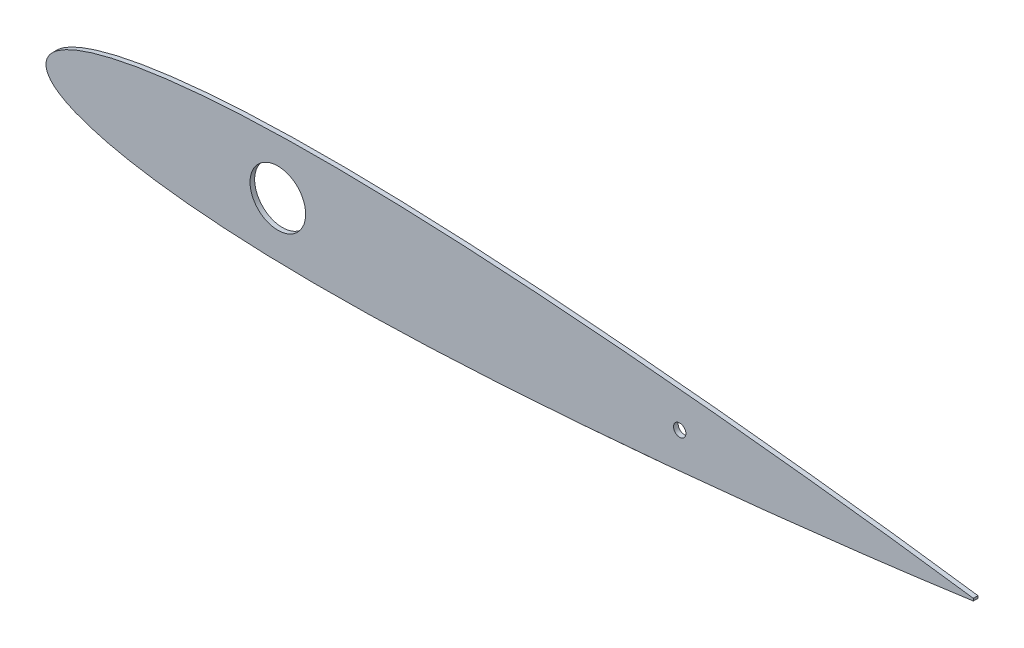
ISO-10303-21;
HEADER;
FILE_DESCRIPTION(('STEP AP214'),'2;1');
FILE_NAME('part.step','',(''),(''),'','','');
FILE_SCHEMA(('AUTOMOTIVE_DESIGN { 1 0 10303 214 1 1 1 1 }'));
ENDSEC;
DATA;
#1=APPLICATION_CONTEXT('core data for automotive mechanical design processes');
#2=APPLICATION_PROTOCOL_DEFINITION('international standard','automotive_design',2000,#1);
#3=PRODUCT_CONTEXT('',#1,'mechanical');
#4=PRODUCT('Part','Part','',(#3));
#5=PRODUCT_RELATED_PRODUCT_CATEGORY('part','',(#4));
#6=PRODUCT_DEFINITION_FORMATION('','',#4);
#7=PRODUCT_DEFINITION_CONTEXT('part definition',#1,'design');
#8=PRODUCT_DEFINITION('design','',#6,#7);
#9=PRODUCT_DEFINITION_SHAPE('','',#8);
#10=(LENGTH_UNIT() NAMED_UNIT(*) SI_UNIT(.MILLI.,.METRE.));
#11=(NAMED_UNIT(*) PLANE_ANGLE_UNIT() SI_UNIT($,.RADIAN.));
#12=(NAMED_UNIT(*) SI_UNIT($,.STERADIAN.) SOLID_ANGLE_UNIT());
#13=UNCERTAINTY_MEASURE_WITH_UNIT(LENGTH_MEASURE(1.E-05),#10,'distance_accuracy_value','');
#14=(GEOMETRIC_REPRESENTATION_CONTEXT(3) GLOBAL_UNCERTAINTY_ASSIGNED_CONTEXT((#13)) GLOBAL_UNIT_ASSIGNED_CONTEXT((#10,
#11,#12)) REPRESENTATION_CONTEXT('',''));
#15=CARTESIAN_POINT('',(0.,0.,0.));
#16=DIRECTION('',(0.,0.,1.));
#17=DIRECTION('',(1.,0.,0.));
#18=AXIS2_PLACEMENT_3D('',#15,#16,#17);
#19=CARTESIAN_POINT('',(300.,0.378,1.5));
#20=CARTESIAN_POINT('',(299.270406423723,0.479445821702321,1.5));
#21=CARTESIAN_POINT('',(297.234667094079,0.762503753929655,1.5));
#22=CARTESIAN_POINT('',(293.659650160598,1.25767350567564,1.5));
#23=CARTESIAN_POINT('',(289.112411794917,1.87424244263317,1.5));
#24=CARTESIAN_POINT('',(284.080816659039,2.54451744035542,1.5));
#25=CARTESIAN_POINT('',(278.752044218457,3.23812231587756,1.5));
#26=CARTESIAN_POINT('',(273.265899022492,3.93494643569603,1.5));
#27=CARTESIAN_POINT('',(267.705955472008,4.62901994283452,1.5));
#28=CARTESIAN_POINT('',(262.114563019878,5.31306910693868,1.5));
#29=CARTESIAN_POINT('',(256.508348909458,5.98219181245687,1.5));
#30=CARTESIAN_POINT('',(250.891738994323,6.63799080906206,1.5));
#31=CARTESIAN_POINT('',(245.269556965141,7.28177923500822,1.5));
#32=CARTESIAN_POINT('',(239.647345348642,7.91223276352409,1.5));
#33=CARTESIAN_POINT('',(234.025130106878,8.52699204615673,1.5));
#34=CARTESIAN_POINT('',(228.399087902931,9.12622976388424,1.5));
#35=CARTESIAN_POINT('',(222.76825764507,9.71307760610579,1.5));
#36=CARTESIAN_POINT('',(217.135920793231,10.2874598097057,1.5));
#37=CARTESIAN_POINT('',(211.505410154051,10.8469410839575,1.5));
#38=CARTESIAN_POINT('',(205.877619803237,11.3916428267252,1.5));
#39=CARTESIAN_POINT('',(200.251512373849,11.9208846239163,1.5));
#40=CARTESIAN_POINT('',(194.626420536409,12.4346170780367,1.5));
#41=CARTESIAN_POINT('',(189.002797137157,12.9319118094686,1.5));
#42=CARTESIAN_POINT('',(183.381530937822,13.4130975813696,1.5));
#43=CARTESIAN_POINT('',(177.763225616091,13.8763767009773,1.5));
#44=CARTESIAN_POINT('',(172.148301533052,14.3212371935345,1.5));
#45=CARTESIAN_POINT('',(166.537529461529,14.7478209184035,1.5));
#46=CARTESIAN_POINT('',(160.931736194082,15.1542281440202,1.5));
#47=CARTESIAN_POINT('',(155.331708850266,15.5391008558727,1.5));
#48=CARTESIAN_POINT('',(149.737538344952,15.9026495636587,1.5));
#49=CARTESIAN_POINT('',(144.148688279318,16.241846118568,1.5));
#50=CARTESIAN_POINT('',(138.565679604284,16.5574205464223,1.5));
#51=CARTESIAN_POINT('',(132.990859803018,16.8473975552547,1.5));
#52=CARTESIAN_POINT('',(127.427439440236,17.1102116785312,1.5));
#53=CARTESIAN_POINT('',(121.877619637439,17.3438917175145,1.5));
#54=CARTESIAN_POINT('',(116.340758577333,17.5452568128182,1.5));
#55=CARTESIAN_POINT('',(110.815476382379,17.712679119923,1.5));
#56=CARTESIAN_POINT('',(105.301273398415,17.8444979379819,1.5));
#57=CARTESIAN_POINT('',(99.8005701155126,17.9400918128776,1.5));
#58=CARTESIAN_POINT('',(94.3174358437247,17.9965904385618,1.5));
#59=CARTESIAN_POINT('',(88.8557640671298,18.0101244579531,1.5));
#60=CARTESIAN_POINT('',(83.4186479748791,17.9792338403315,1.5));
#61=CARTESIAN_POINT('',(78.0084808270908,17.8991607130085,1.5));
#62=CARTESIAN_POINT('',(72.6284553647751,17.7670337872511,1.5));
#63=CARTESIAN_POINT('',(67.2827387457577,17.5794139337101,1.5));
#64=CARTESIAN_POINT('',(61.9773648945375,17.331515488689,1.5));
#65=CARTESIAN_POINT('',(56.7206910156783,17.0210326511062,1.5));
#66=CARTESIAN_POINT('',(51.5251753215055,16.6409580698619,1.5));
#67=CARTESIAN_POINT('',(46.4082026187076,16.1901885907441,1.5));
#68=CARTESIAN_POINT('',(41.3941760651905,15.6616690993154,1.5));
#69=CARTESIAN_POINT('',(36.5156710865437,15.0539637839737,1.5));
#70=CARTESIAN_POINT('',(31.8190094409283,14.3656236049764,1.5));
#71=CARTESIAN_POINT('',(27.3661648285309,13.6034756838757,1.5));
#72=CARTESIAN_POINT('',(23.2352179540624,12.7825834438859,1.5));
#73=CARTESIAN_POINT('',(19.5026424507863,11.9202507512816,1.5));
#74=CARTESIAN_POINT('',(16.2182713927649,11.0445977962822,1.5));
#75=CARTESIAN_POINT('',(13.3891860155784,10.1750762553965,1.5));
#76=CARTESIAN_POINT('',(10.9849293334544,9.33349871540906,1.5));
#77=CARTESIAN_POINT('',(8.96156147750924,8.52206288153796,1.5));
#78=CARTESIAN_POINT('',(7.26729205281864,7.74697600174495,1.5));
#79=CARTESIAN_POINT('',(5.84605246563954,7.01062562176008,1.5));
#80=CARTESIAN_POINT('',(4.64771108498271,6.30063403293287,1.5));
#81=CARTESIAN_POINT('',(3.62823525123192,5.60651366797511,1.5));
#82=CARTESIAN_POINT('',(2.75190919699738,4.92663525162572,1.5));
#83=CARTESIAN_POINT('',(2.0062573601689,4.24991725904032,1.5));
#84=CARTESIAN_POINT('',(1.39058613668709,3.570259491991,1.5));
#85=CARTESIAN_POINT('',(0.901000434809516,2.89094225228363,1.5));
#86=CARTESIAN_POINT('',(0.529275534924718,2.22021927340558,1.5));
#87=CARTESIAN_POINT('',(0.260479536936117,1.56645893590234,1.5));
#88=CARTESIAN_POINT('',(0.0857126538537306,0.931035928118987,1.5));
#89=CARTESIAN_POINT('',(-0.00350924718492415,0.308981014512189,1.5));
#90=CARTESIAN_POINT('',(-0.00350924718492199,-0.308981014512209,1.5));
#91=CARTESIAN_POINT('',(0.0857126538537279,-0.931035928118965,1.5));
#92=CARTESIAN_POINT('',(0.260479536936107,-1.56645893590232,1.5));
#93=CARTESIAN_POINT('',(0.529275534924743,-2.2202192734056,1.5));
#94=CARTESIAN_POINT('',(0.901000434809474,-2.89094225228368,1.5));
#95=CARTESIAN_POINT('',(1.39058613668717,-3.57025949199063,1.5));
#96=CARTESIAN_POINT('',(2.00625736016862,-4.24991725904197,1.5));
#97=CARTESIAN_POINT('',(2.75190919699857,-4.92663525161857,1.5));
#98=CARTESIAN_POINT('',(3.62823525122678,-5.60651366800603,1.5));
#99=CARTESIAN_POINT('',(4.6477110850053,-6.3006340327972,1.5));
#100=CARTESIAN_POINT('',(5.84605246553727,-7.01062562237321,1.5));
#101=CARTESIAN_POINT('',(7.26729205329404,-7.74697599889616,1.5));
#102=CARTESIAN_POINT('',(8.96156147525896,-8.5220628950217,1.5));
#103=CARTESIAN_POINT('',(10.9849293441544,-9.33349865129378,1.5));
#104=CARTESIAN_POINT('',(13.3891859649807,-10.1750765585832,1.5));
#105=CARTESIAN_POINT('',(16.218271629693,-11.0445963765829,1.5));
#106=CARTESIAN_POINT('',(19.5026413612413,-11.9202572799561,1.5));
#107=CARTESIAN_POINT('',(23.2352227989104,-12.78255441302,1.5));
#108=CARTESIAN_POINT('',(27.3661275586072,-13.6035961608478,1.5));
#109=CARTESIAN_POINT('',(31.8190750083372,-14.3651133634918,1.5));
#110=CARTESIAN_POINT('',(36.5156346373272,-15.0541060972868,1.5));
#111=CARTESIAN_POINT('',(41.3941822041013,-15.6616288870965,1.5));
#112=CARTESIAN_POINT('',(46.4082009236496,-16.1901996940233,1.5));
#113=CARTESIAN_POINT('',(51.5251757859908,-16.6409550273053,1.5));
#114=CARTESIAN_POINT('',(56.7206908890808,-17.0210334803687,1.5));
#115=CARTESIAN_POINT('',(61.9773649289189,-17.3315152634777,1.5));
#116=CARTESIAN_POINT('',(67.2827387364428,-17.5794139947263,1.5));
#117=CARTESIAN_POINT('',(72.6284553672946,-17.767033770747,1.5));
#118=CARTESIAN_POINT('',(78.0084808264101,-17.8991607174675,1.5));
#119=CARTESIAN_POINT('',(83.4186479750628,-17.9792338391277,1.5));
#120=CARTESIAN_POINT('',(88.8557640670803,-18.0101244582778,1.5));
#121=CARTESIAN_POINT('',(94.317435843738,-17.9965904384742,1.5));
#122=CARTESIAN_POINT('',(99.8005701155091,-17.9400918129012,1.5));
#123=CARTESIAN_POINT('',(105.301273398416,-17.8444979379756,1.5));
#124=CARTESIAN_POINT('',(110.815476382379,-17.7126791199247,1.5));
#125=CARTESIAN_POINT('',(116.340758577333,-17.5452568128177,1.5));
#126=CARTESIAN_POINT('',(121.877619637439,-17.3438917175146,1.5));
#127=CARTESIAN_POINT('',(127.427439440236,-17.1102116785312,1.5));
#128=CARTESIAN_POINT('',(132.990859803018,-16.8473975552547,1.5));
#129=CARTESIAN_POINT('',(138.565679604284,-16.5574205464223,1.5));
#130=CARTESIAN_POINT('',(144.148688279318,-16.241846118568,1.5));
#131=CARTESIAN_POINT('',(149.737538344952,-15.9026495636587,1.5));
#132=CARTESIAN_POINT('',(155.331708850266,-15.5391008558727,1.5));
#133=CARTESIAN_POINT('',(160.931736194082,-15.1542281440202,1.5));
#134=CARTESIAN_POINT('',(166.537529461529,-14.7478209184035,1.5));
#135=CARTESIAN_POINT('',(172.148301533052,-14.3212371935345,1.5));
#136=CARTESIAN_POINT('',(177.763225616091,-13.8763767009773,1.5));
#137=CARTESIAN_POINT('',(183.381530937822,-13.4130975813696,1.5));
#138=CARTESIAN_POINT('',(189.002797137156,-12.9319118094686,1.5));
#139=CARTESIAN_POINT('',(194.626420536409,-12.4346170780367,1.5));
#140=CARTESIAN_POINT('',(200.251512373849,-11.9208846239163,1.5));
#141=CARTESIAN_POINT('',(205.877619803237,-11.3916428267251,1.5));
#142=CARTESIAN_POINT('',(211.505410154051,-10.8469410839575,1.5));
#143=CARTESIAN_POINT('',(217.135920793231,-10.2874598097057,1.5));
#144=CARTESIAN_POINT('',(222.76825764507,-9.71307760610578,1.5));
#145=CARTESIAN_POINT('',(228.399087902931,-9.12622976388424,1.5));
#146=CARTESIAN_POINT('',(234.025130106878,-8.52699204615673,1.5));
#147=CARTESIAN_POINT('',(239.647345348642,-7.91223276352409,1.5));
#148=CARTESIAN_POINT('',(245.269556965141,-7.28177923500822,1.5));
#149=CARTESIAN_POINT('',(250.891738994323,-6.63799080906206,1.5));
#150=CARTESIAN_POINT('',(256.508348909458,-5.98219181245686,1.5));
#151=CARTESIAN_POINT('',(262.114563019878,-5.31306910693868,1.5));
#152=CARTESIAN_POINT('',(267.705955472008,-4.62901994283452,1.5));
#153=CARTESIAN_POINT('',(273.265899022492,-3.93494643569603,1.5));
#154=CARTESIAN_POINT('',(278.752044218457,-3.23812231587756,1.5));
#155=CARTESIAN_POINT('',(284.080816659039,-2.54451744035542,1.5));
#156=CARTESIAN_POINT('',(289.112411794917,-1.87424244263317,1.5));
#157=CARTESIAN_POINT('',(293.659650160598,-1.25767350567564,1.5));
#158=CARTESIAN_POINT('',(297.234667094079,-0.76250375392966,1.5));
#159=CARTESIAN_POINT('',(299.270406423723,-0.479445821702321,1.5));
#160=CARTESIAN_POINT('',(300.,-0.378,1.5));
#161=B_SPLINE_CURVE_WITH_KNOTS('',3,(#19,#20,#21,#22,#23,#24,#25,#26,#27,#28,#29,#30,#31,#32,
#33,#34,#35,#36,#37,#38,#39,#40,#41,#42,#43,#44,#45,#46,#47,#48,#49,#50,#51,#52,#53,#54,#55,#56,
#57,#58,#59,#60,#61,#62,#63,#64,#65,#66,#67,#68,#69,#70,#71,#72,#73,#74,#75,#76,#77,#78,#79,#80,
#81,#82,#83,#84,#85,#86,#87,#88,#89,#90,#91,#92,#93,#94,#95,#96,#97,#98,#99,#100,#101,#102,#103,
#104,#105,#106,#107,#108,#109,#110,#111,#112,#113,#114,#115,#116,#117,#118,#119,#120,#121,#122,
#123,#124,#125,#126,#127,#128,#129,#130,#131,#132,#133,#134,#135,#136,#137,#138,#139,#140,#141,
#142,#143,#144,#145,#146,#147,#148,#149,#150,#151,#152,#153,#154,#155,#156,#157,#158,#159,#160),
.UNSPECIFIED.,.F.,.F.,(4,1,1,1,1,1,1,1,1,1,1,1,1,1,1,1,1,1,1,1,1,1,1,1,1,1,1,1,1,1,1,1,1,1,1,1,
1,1,1,1,1,1,1,1,1,1,1,1,1,1,1,1,1,1,1,1,1,1,1,1,1,1,1,1,1,1,1,1,1,1,1,1,1,1,1,1,1,1,1,1,1,1,1,1,
1,1,1,1,1,1,1,1,1,1,1,1,1,1,1,1,1,1,1,1,1,1,1,1,1,1,1,1,1,1,1,1,1,1,1,1,1,1,1,1,1,1,1,1,1,1,1,1,
1,1,1,1,1,1,1,4),(0.,0.00361222059404388,0.0100789532278554,0.0176986181570895,
0.0261151107220122,0.0349709660638799,0.0440503796486832,0.0532343297369713,0.0624475697827881,
0.0716739929600303,0.0809213185094618,0.0901775382979332,0.0994243421366575,0.108664440992277,
0.117912199004999,0.127169502180609,0.136426594565023,0.145675425736823,0.154916495397513,
0.164153236916375,0.173386648526191,0.182615736180586,0.191838089492061,0.201053134496137,
0.210260392550908,0.219458942389608,0.228646746886173,0.237822316287067,0.24698522413025,
0.25613738364592,0.265279415916296,0.274406949966901,0.283512193452554,0.292591781113348,
0.30164628535433,0.310681792653752,0.31969906757785,0.32869451957993,0.337660159695399,
0.346588583205171,0.355477411634764,0.364322937295264,0.373121613643215,0.381867635356829,
0.390553004884712,0.399166025869356,0.407689628257838,0.416098119030288,0.424354887451602,
0.432412428746428,0.440204728485537,0.447630505181733,0.454563637698397,0.460855379429517,
0.466413319364109,0.471228610451128,0.475365774282038,0.478901259753558,0.481915077255184,
0.484498871900912,0.486747127386087,0.488741251833575,0.490543179252672,0.492182103901344,
0.493672830547239,0.495031907807012,0.496279059618418,0.497424736506128,0.498490165528455,
0.499502757789975,0.500497253863142,0.501509846124661,0.502575275146988,0.503720952034698,
0.504968103846104,0.506327181105877,0.507817907751772,0.509456832400444,0.511258759819541,
0.51325288426703,0.515501139752205,0.518084934397933,0.521098751899559,0.524634237371078,
0.528771401201989,0.533586692289008,0.539144632223599,0.545436373954719,0.552369506471383,
0.559795200118754,0.567587571253572,0.575645112548398,0.583901880969712,0.592310371742162,
0.600833974130644,0.609446995115288,0.618132364643171,0.626878386356785,0.635677062704736,
0.644522588365236,0.653411416794829,0.662339840304601,0.67130548042007,0.68030093242215,
0.689318207346248,0.69835371464567,0.707408218886652,0.716487806547446,0.725593050033099,
0.734720584083704,0.74386261635408,0.75301477586975,0.762177683712933,0.771353253113827,
0.780541057610392,0.789739607449093,0.798946865503863,0.808161910507939,0.817384263819414,
0.826613351473809,0.835846763083625,0.845083504602487,0.854324574263177,0.863573405434977,
0.872830497819391,0.882087800995001,0.891335559007723,0.900575657863343,0.909822461702067,
0.919078681490538,0.92832600703997,0.937552430217212,0.946765670263029,0.955949620351317,
0.96502903393612,0.973884889277988,0.982301381842911,0.989921046772145,0.996387779405956,1.),.UNSPECIFIED.);
#162=DIRECTION('',(0.,0.,-1.));
#163=VECTOR('',#162,1.);
#164=SURFACE_OF_LINEAR_EXTRUSION('',#161,#163);
#165=CARTESIAN_POINT('',(300.,0.378,0.));
#166=CARTESIAN_POINT('',(299.270406423723,0.479445821702321,0.));
#167=CARTESIAN_POINT('',(297.234667094079,0.762503753929655,0.));
#168=CARTESIAN_POINT('',(293.659650160598,1.25767350567564,0.));
#169=CARTESIAN_POINT('',(289.112411794917,1.87424244263317,0.));
#170=CARTESIAN_POINT('',(284.080816659039,2.54451744035542,0.));
#171=CARTESIAN_POINT('',(278.752044218457,3.23812231587756,0.));
#172=CARTESIAN_POINT('',(273.265899022492,3.93494643569603,0.));
#173=CARTESIAN_POINT('',(267.705955472008,4.62901994283452,0.));
#174=CARTESIAN_POINT('',(262.114563019878,5.31306910693868,0.));
#175=CARTESIAN_POINT('',(256.508348909458,5.98219181245687,0.));
#176=CARTESIAN_POINT('',(250.891738994323,6.63799080906206,0.));
#177=CARTESIAN_POINT('',(245.269556965141,7.28177923500822,0.));
#178=CARTESIAN_POINT('',(239.647345348642,7.91223276352409,0.));
#179=CARTESIAN_POINT('',(234.025130106878,8.52699204615673,0.));
#180=CARTESIAN_POINT('',(228.399087902931,9.12622976388424,0.));
#181=CARTESIAN_POINT('',(222.76825764507,9.71307760610579,0.));
#182=CARTESIAN_POINT('',(217.135920793231,10.2874598097057,0.));
#183=CARTESIAN_POINT('',(211.505410154051,10.8469410839575,0.));
#184=CARTESIAN_POINT('',(205.877619803237,11.3916428267252,0.));
#185=CARTESIAN_POINT('',(200.251512373849,11.9208846239163,0.));
#186=CARTESIAN_POINT('',(194.626420536409,12.4346170780367,0.));
#187=CARTESIAN_POINT('',(189.002797137157,12.9319118094686,0.));
#188=CARTESIAN_POINT('',(183.381530937822,13.4130975813696,0.));
#189=CARTESIAN_POINT('',(177.763225616091,13.8763767009773,0.));
#190=CARTESIAN_POINT('',(172.148301533052,14.3212371935345,0.));
#191=CARTESIAN_POINT('',(166.537529461529,14.7478209184035,0.));
#192=CARTESIAN_POINT('',(160.931736194082,15.1542281440202,0.));
#193=CARTESIAN_POINT('',(155.331708850266,15.5391008558727,0.));
#194=CARTESIAN_POINT('',(149.737538344952,15.9026495636587,0.));
#195=CARTESIAN_POINT('',(144.148688279318,16.241846118568,0.));
#196=CARTESIAN_POINT('',(138.565679604284,16.5574205464223,0.));
#197=CARTESIAN_POINT('',(132.990859803018,16.8473975552547,0.));
#198=CARTESIAN_POINT('',(127.427439440236,17.1102116785312,0.));
#199=CARTESIAN_POINT('',(121.877619637439,17.3438917175145,0.));
#200=CARTESIAN_POINT('',(116.340758577333,17.5452568128182,0.));
#201=CARTESIAN_POINT('',(110.815476382379,17.712679119923,0.));
#202=CARTESIAN_POINT('',(105.301273398415,17.8444979379819,0.));
#203=CARTESIAN_POINT('',(99.8005701155126,17.9400918128776,0.));
#204=CARTESIAN_POINT('',(94.3174358437247,17.9965904385618,0.));
#205=CARTESIAN_POINT('',(88.8557640671298,18.0101244579531,0.));
#206=CARTESIAN_POINT('',(83.4186479748791,17.9792338403315,0.));
#207=CARTESIAN_POINT('',(78.0084808270908,17.8991607130085,0.));
#208=CARTESIAN_POINT('',(72.6284553647751,17.7670337872511,0.));
#209=CARTESIAN_POINT('',(67.2827387457577,17.5794139337101,0.));
#210=CARTESIAN_POINT('',(61.9773648945375,17.331515488689,0.));
#211=CARTESIAN_POINT('',(56.7206910156783,17.0210326511062,0.));
#212=CARTESIAN_POINT('',(51.5251753215055,16.6409580698619,0.));
#213=CARTESIAN_POINT('',(46.4082026187076,16.1901885907441,0.));
#214=CARTESIAN_POINT('',(41.3941760651905,15.6616690993154,0.));
#215=CARTESIAN_POINT('',(36.5156710865437,15.0539637839737,0.));
#216=CARTESIAN_POINT('',(31.8190094409283,14.3656236049764,0.));
#217=CARTESIAN_POINT('',(27.3661648285309,13.6034756838757,0.));
#218=CARTESIAN_POINT('',(23.2352179540624,12.7825834438859,0.));
#219=CARTESIAN_POINT('',(19.5026424507863,11.9202507512816,0.));
#220=CARTESIAN_POINT('',(16.2182713927649,11.0445977962822,0.));
#221=CARTESIAN_POINT('',(13.3891860155784,10.1750762553965,0.));
#222=CARTESIAN_POINT('',(10.9849293334544,9.33349871540906,0.));
#223=CARTESIAN_POINT('',(8.96156147750924,8.52206288153796,0.));
#224=CARTESIAN_POINT('',(7.26729205281864,7.74697600174495,0.));
#225=CARTESIAN_POINT('',(5.84605246563954,7.01062562176008,0.));
#226=CARTESIAN_POINT('',(4.64771108498271,6.30063403293287,0.));
#227=CARTESIAN_POINT('',(3.62823525123192,5.60651366797511,0.));
#228=CARTESIAN_POINT('',(2.75190919699738,4.92663525162572,0.));
#229=CARTESIAN_POINT('',(2.0062573601689,4.24991725904032,0.));
#230=CARTESIAN_POINT('',(1.39058613668709,3.570259491991,0.));
#231=CARTESIAN_POINT('',(0.901000434809516,2.89094225228363,0.));
#232=CARTESIAN_POINT('',(0.529275534924718,2.22021927340558,0.));
#233=CARTESIAN_POINT('',(0.260479536936117,1.56645893590234,0.));
#234=CARTESIAN_POINT('',(0.0857126538537306,0.931035928118987,0.));
#235=CARTESIAN_POINT('',(-0.00350924718492415,0.308981014512189,0.));
#236=CARTESIAN_POINT('',(-0.00350924718492199,-0.308981014512209,0.));
#237=CARTESIAN_POINT('',(0.0857126538537279,-0.931035928118965,0.));
#238=CARTESIAN_POINT('',(0.260479536936107,-1.56645893590232,0.));
#239=CARTESIAN_POINT('',(0.529275534924743,-2.2202192734056,0.));
#240=CARTESIAN_POINT('',(0.901000434809474,-2.89094225228368,0.));
#241=CARTESIAN_POINT('',(1.39058613668717,-3.57025949199063,0.));
#242=CARTESIAN_POINT('',(2.00625736016862,-4.24991725904197,0.));
#243=CARTESIAN_POINT('',(2.75190919699857,-4.92663525161857,0.));
#244=CARTESIAN_POINT('',(3.62823525122678,-5.60651366800603,0.));
#245=CARTESIAN_POINT('',(4.6477110850053,-6.3006340327972,0.));
#246=CARTESIAN_POINT('',(5.84605246553727,-7.01062562237321,0.));
#247=CARTESIAN_POINT('',(7.26729205329404,-7.74697599889616,0.));
#248=CARTESIAN_POINT('',(8.96156147525896,-8.5220628950217,0.));
#249=CARTESIAN_POINT('',(10.9849293441544,-9.33349865129378,0.));
#250=CARTESIAN_POINT('',(13.3891859649807,-10.1750765585832,0.));
#251=CARTESIAN_POINT('',(16.218271629693,-11.0445963765829,0.));
#252=CARTESIAN_POINT('',(19.5026413612413,-11.9202572799561,0.));
#253=CARTESIAN_POINT('',(23.2352227989104,-12.78255441302,0.));
#254=CARTESIAN_POINT('',(27.3661275586072,-13.6035961608478,0.));
#255=CARTESIAN_POINT('',(31.8190750083372,-14.3651133634918,0.));
#256=CARTESIAN_POINT('',(36.5156346373272,-15.0541060972868,0.));
#257=CARTESIAN_POINT('',(41.3941822041013,-15.6616288870965,0.));
#258=CARTESIAN_POINT('',(46.4082009236496,-16.1901996940233,0.));
#259=CARTESIAN_POINT('',(51.5251757859908,-16.6409550273053,0.));
#260=CARTESIAN_POINT('',(56.7206908890808,-17.0210334803687,0.));
#261=CARTESIAN_POINT('',(61.9773649289189,-17.3315152634777,0.));
#262=CARTESIAN_POINT('',(67.2827387364428,-17.5794139947263,0.));
#263=CARTESIAN_POINT('',(72.6284553672946,-17.767033770747,0.));
#264=CARTESIAN_POINT('',(78.0084808264101,-17.8991607174675,0.));
#265=CARTESIAN_POINT('',(83.4186479750628,-17.9792338391277,0.));
#266=CARTESIAN_POINT('',(88.8557640670803,-18.0101244582778,0.));
#267=CARTESIAN_POINT('',(94.317435843738,-17.9965904384742,0.));
#268=CARTESIAN_POINT('',(99.8005701155091,-17.9400918129012,0.));
#269=CARTESIAN_POINT('',(105.301273398416,-17.8444979379756,0.));
#270=CARTESIAN_POINT('',(110.815476382379,-17.7126791199247,0.));
#271=CARTESIAN_POINT('',(116.340758577333,-17.5452568128177,0.));
#272=CARTESIAN_POINT('',(121.877619637439,-17.3438917175146,0.));
#273=CARTESIAN_POINT('',(127.427439440236,-17.1102116785312,0.));
#274=CARTESIAN_POINT('',(132.990859803018,-16.8473975552547,0.));
#275=CARTESIAN_POINT('',(138.565679604284,-16.5574205464223,0.));
#276=CARTESIAN_POINT('',(144.148688279318,-16.241846118568,0.));
#277=CARTESIAN_POINT('',(149.737538344952,-15.9026495636587,0.));
#278=CARTESIAN_POINT('',(155.331708850266,-15.5391008558727,0.));
#279=CARTESIAN_POINT('',(160.931736194082,-15.1542281440202,0.));
#280=CARTESIAN_POINT('',(166.537529461529,-14.7478209184035,0.));
#281=CARTESIAN_POINT('',(172.148301533052,-14.3212371935345,0.));
#282=CARTESIAN_POINT('',(177.763225616091,-13.8763767009773,0.));
#283=CARTESIAN_POINT('',(183.381530937822,-13.4130975813696,0.));
#284=CARTESIAN_POINT('',(189.002797137156,-12.9319118094686,0.));
#285=CARTESIAN_POINT('',(194.626420536409,-12.4346170780367,0.));
#286=CARTESIAN_POINT('',(200.251512373849,-11.9208846239163,0.));
#287=CARTESIAN_POINT('',(205.877619803237,-11.3916428267251,0.));
#288=CARTESIAN_POINT('',(211.505410154051,-10.8469410839575,0.));
#289=CARTESIAN_POINT('',(217.135920793231,-10.2874598097057,0.));
#290=CARTESIAN_POINT('',(222.76825764507,-9.71307760610578,0.));
#291=CARTESIAN_POINT('',(228.399087902931,-9.12622976388424,0.));
#292=CARTESIAN_POINT('',(234.025130106878,-8.52699204615673,0.));
#293=CARTESIAN_POINT('',(239.647345348642,-7.91223276352409,0.));
#294=CARTESIAN_POINT('',(245.269556965141,-7.28177923500822,0.));
#295=CARTESIAN_POINT('',(250.891738994323,-6.63799080906206,0.));
#296=CARTESIAN_POINT('',(256.508348909458,-5.98219181245686,0.));
#297=CARTESIAN_POINT('',(262.114563019878,-5.31306910693868,0.));
#298=CARTESIAN_POINT('',(267.705955472008,-4.62901994283452,0.));
#299=CARTESIAN_POINT('',(273.265899022492,-3.93494643569603,0.));
#300=CARTESIAN_POINT('',(278.752044218457,-3.23812231587756,0.));
#301=CARTESIAN_POINT('',(284.080816659039,-2.54451744035542,0.));
#302=CARTESIAN_POINT('',(289.112411794917,-1.87424244263317,0.));
#303=CARTESIAN_POINT('',(293.659650160598,-1.25767350567564,0.));
#304=CARTESIAN_POINT('',(297.234667094079,-0.76250375392966,0.));
#305=CARTESIAN_POINT('',(299.270406423723,-0.479445821702321,0.));
#306=CARTESIAN_POINT('',(300.,-0.378,0.));
#307=B_SPLINE_CURVE_WITH_KNOTS('',3,(#165,#166,#167,#168,#169,#170,#171,#172,#173,#174,#175,
#176,#177,#178,#179,#180,#181,#182,#183,#184,#185,#186,#187,#188,#189,#190,#191,#192,#193,#194,
#195,#196,#197,#198,#199,#200,#201,#202,#203,#204,#205,#206,#207,#208,#209,#210,#211,#212,#213,
#214,#215,#216,#217,#218,#219,#220,#221,#222,#223,#224,#225,#226,#227,#228,#229,#230,#231,#232,
#233,#234,#235,#236,#237,#238,#239,#240,#241,#242,#243,#244,#245,#246,#247,#248,#249,#250,#251,
#252,#253,#254,#255,#256,#257,#258,#259,#260,#261,#262,#263,#264,#265,#266,#267,#268,#269,#270,
#271,#272,#273,#274,#275,#276,#277,#278,#279,#280,#281,#282,#283,#284,#285,#286,#287,#288,#289,
#290,#291,#292,#293,#294,#295,#296,#297,#298,#299,#300,#301,#302,#303,#304,#305,#306),
.UNSPECIFIED.,.F.,.F.,(4,1,1,1,1,1,1,1,1,1,1,1,1,1,1,1,1,1,1,1,1,1,1,1,1,1,1,1,1,1,1,1,1,1,1,1,
1,1,1,1,1,1,1,1,1,1,1,1,1,1,1,1,1,1,1,1,1,1,1,1,1,1,1,1,1,1,1,1,1,1,1,1,1,1,1,1,1,1,1,1,1,1,1,1,
1,1,1,1,1,1,1,1,1,1,1,1,1,1,1,1,1,1,1,1,1,1,1,1,1,1,1,1,1,1,1,1,1,1,1,1,1,1,1,1,1,1,1,1,1,1,1,1,
1,1,1,1,1,1,1,4),(0.,0.00361222059404388,0.0100789532278554,0.0176986181570895,
0.0261151107220122,0.0349709660638799,0.0440503796486832,0.0532343297369713,0.0624475697827881,
0.0716739929600303,0.0809213185094618,0.0901775382979332,0.0994243421366575,0.108664440992277,
0.117912199004999,0.127169502180609,0.136426594565023,0.145675425736823,0.154916495397513,
0.164153236916375,0.173386648526191,0.182615736180586,0.191838089492061,0.201053134496137,
0.210260392550908,0.219458942389608,0.228646746886173,0.237822316287067,0.24698522413025,
0.25613738364592,0.265279415916296,0.274406949966901,0.283512193452554,0.292591781113348,
0.30164628535433,0.310681792653752,0.31969906757785,0.32869451957993,0.337660159695399,
0.346588583205171,0.355477411634764,0.364322937295264,0.373121613643215,0.381867635356829,
0.390553004884712,0.399166025869356,0.407689628257838,0.416098119030288,0.424354887451602,
0.432412428746428,0.440204728485537,0.447630505181733,0.454563637698397,0.460855379429517,
0.466413319364109,0.471228610451128,0.475365774282038,0.478901259753558,0.481915077255184,
0.484498871900912,0.486747127386087,0.488741251833575,0.490543179252672,0.492182103901344,
0.493672830547239,0.495031907807012,0.496279059618418,0.497424736506128,0.498490165528455,
0.499502757789975,0.500497253863142,0.501509846124661,0.502575275146988,0.503720952034698,
0.504968103846104,0.506327181105877,0.507817907751772,0.509456832400444,0.511258759819541,
0.51325288426703,0.515501139752205,0.518084934397933,0.521098751899559,0.524634237371078,
0.528771401201989,0.533586692289008,0.539144632223599,0.545436373954719,0.552369506471383,
0.559795200118754,0.567587571253572,0.575645112548398,0.583901880969712,0.592310371742162,
0.600833974130644,0.609446995115288,0.618132364643171,0.626878386356785,0.635677062704736,
0.644522588365236,0.653411416794829,0.662339840304601,0.67130548042007,0.68030093242215,
0.689318207346248,0.69835371464567,0.707408218886652,0.716487806547446,0.725593050033099,
0.734720584083704,0.74386261635408,0.75301477586975,0.762177683712933,0.771353253113827,
0.780541057610392,0.789739607449093,0.798946865503863,0.808161910507939,0.817384263819414,
0.826613351473809,0.835846763083625,0.845083504602487,0.854324574263177,0.863573405434977,
0.872830497819391,0.882087800995001,0.891335559007723,0.900575657863343,0.909822461702067,
0.919078681490538,0.92832600703997,0.937552430217212,0.946765670263029,0.955949620351317,
0.96502903393612,0.973884889277988,0.982301381842911,0.989921046772145,0.996387779405956,1.),.UNSPECIFIED.);
#308=CARTESIAN_POINT('',(300.,0.378,0.));
#309=VERTEX_POINT('',#308);
#310=CARTESIAN_POINT('',(300.,-0.378,0.));
#311=VERTEX_POINT('',#310);
#312=EDGE_CURVE('E67',#309,#311,#307,.T.);
#313=ORIENTED_EDGE('',*,*,#312,.T.);
#314=DIRECTION('',(0.,0.,-1.));
#315=VECTOR('',#314,1.);
#316=CARTESIAN_POINT('',(300.,-0.378,1.5));
#317=LINE('',#316,#315);
#318=CARTESIAN_POINT('',(300.,-0.378,1.5));
#319=VERTEX_POINT('',#318);
#320=EDGE_CURVE('E11',#319,#311,#317,.T.);
#321=ORIENTED_EDGE('',*,*,#320,.F.);
#322=CARTESIAN_POINT('',(300.,0.378,1.5));
#323=VERTEX_POINT('',#322);
#324=EDGE_CURVE('E66',#323,#319,#161,.T.);
#325=ORIENTED_EDGE('',*,*,#324,.F.);
#326=DIRECTION('',(0.,0.,-1.));
#327=VECTOR('',#326,1.);
#328=CARTESIAN_POINT('',(300.,0.378,1.5));
#329=LINE('',#328,#327);
#330=EDGE_CURVE('E44',#323,#309,#329,.T.);
#331=ORIENTED_EDGE('',*,*,#330,.T.);
#332=EDGE_LOOP('',(#313,#321,#325,#331));
#333=FACE_BOUND('',#332,.T.);
#334=ADVANCED_FACE('F35',(#333),#164,.F.);
#335=CARTESIAN_POINT('',(300.,0.378,1.5));
#336=DIRECTION('',(-1.,0.,0.));
#337=DIRECTION('',(0.,0.,1.));
#338=AXIS2_PLACEMENT_3D('',#335,#336,#337);
#339=PLANE('',#338);
#340=DIRECTION('',(0.,1.,0.));
#341=VECTOR('',#340,1.);
#342=CARTESIAN_POINT('',(300.,0.378,0.));
#343=LINE('',#342,#341);
#344=EDGE_CURVE('E59',#311,#309,#343,.T.);
#345=ORIENTED_EDGE('',*,*,#344,.T.);
#346=ORIENTED_EDGE('',*,*,#330,.F.);
#347=DIRECTION('',(0.,1.,0.));
#348=VECTOR('',#347,1.);
#349=CARTESIAN_POINT('',(300.,0.378,1.5));
#350=LINE('',#349,#348);
#351=EDGE_CURVE('E51',#319,#323,#350,.T.);
#352=ORIENTED_EDGE('',*,*,#351,.F.);
#353=ORIENTED_EDGE('',*,*,#320,.T.);
#354=EDGE_LOOP('',(#345,#346,#352,#353));
#355=FACE_BOUND('',#354,.T.);
#356=ADVANCED_FACE('F62',(#355),#339,.F.);
#357=CARTESIAN_POINT('',(6.8064612781216E-05,3.56765379046865E-06,1.5));
#358=DIRECTION('',(0.,0.,-1.));
#359=DIRECTION('',(-1.,0.,0.));
#360=AXIS2_PLACEMENT_3D('',#357,#358,#359);
#361=PLANE('',#360);
#362=CARTESIAN_POINT('',(75.,0.,1.5));
#363=DIRECTION('',(0.,0.,1.));
#364=DIRECTION('',(1.,0.,0.));
#365=AXIS2_PLACEMENT_3D('',#362,#363,#364);
#366=CIRCLE('',#365,9.);
#367=CARTESIAN_POINT('',(84.,0.,1.5));
#368=VERTEX_POINT('',#367);
#369=EDGE_CURVE('E74',#368,#368,#366,.T.);
#370=ORIENTED_EDGE('',*,*,#369,.F.);
#371=EDGE_LOOP('',(#370));
#372=FACE_BOUND('',#371,.T.);
#373=CARTESIAN_POINT('',(205.,0.,1.5));
#374=DIRECTION('',(0.,0.,1.));
#375=DIRECTION('',(1.,0.,0.));
#376=AXIS2_PLACEMENT_3D('',#373,#374,#375);
#377=CIRCLE('',#376,2.);
#378=CARTESIAN_POINT('',(207.,0.,1.5));
#379=VERTEX_POINT('',#378);
#380=EDGE_CURVE('E86',#379,#379,#377,.T.);
#381=ORIENTED_EDGE('',*,*,#380,.F.);
#382=EDGE_LOOP('',(#381));
#383=FACE_BOUND('',#382,.T.);
#384=ORIENTED_EDGE('',*,*,#324,.T.);
#385=ORIENTED_EDGE('',*,*,#351,.T.);
#386=EDGE_LOOP('',(#384,#385));
#387=FACE_BOUND('',#386,.T.);
#388=ADVANCED_FACE('F100',(#372,#383,#387),#361,.F.);
#389=CARTESIAN_POINT('',(6.8064612781216E-05,3.56765379046865E-06,0.));
#390=DIRECTION('',(0.,0.,-1.));
#391=DIRECTION('',(-1.,0.,0.));
#392=AXIS2_PLACEMENT_3D('',#389,#390,#391);
#393=PLANE('',#392);
#394=CARTESIAN_POINT('',(75.,0.,0.));
#395=DIRECTION('',(0.,0.,1.));
#396=DIRECTION('',(1.,0.,0.));
#397=AXIS2_PLACEMENT_3D('',#394,#395,#396);
#398=CIRCLE('',#397,9.);
#399=CARTESIAN_POINT('',(84.,0.,0.));
#400=VERTEX_POINT('',#399);
#401=EDGE_CURVE('E71',#400,#400,#398,.T.);
#402=ORIENTED_EDGE('',*,*,#401,.T.);
#403=EDGE_LOOP('',(#402));
#404=FACE_BOUND('',#403,.T.);
#405=CARTESIAN_POINT('',(205.,0.,0.));
#406=DIRECTION('',(0.,0.,1.));
#407=DIRECTION('',(1.,0.,0.));
#408=AXIS2_PLACEMENT_3D('',#405,#406,#407);
#409=CIRCLE('',#408,2.);
#410=CARTESIAN_POINT('',(207.,0.,0.));
#411=VERTEX_POINT('',#410);
#412=EDGE_CURVE('E92',#411,#411,#409,.T.);
#413=ORIENTED_EDGE('',*,*,#412,.T.);
#414=EDGE_LOOP('',(#413));
#415=FACE_BOUND('',#414,.T.);
#416=ORIENTED_EDGE('',*,*,#312,.F.);
#417=ORIENTED_EDGE('',*,*,#344,.F.);
#418=EDGE_LOOP('',(#416,#417));
#419=FACE_BOUND('',#418,.T.);
#420=ADVANCED_FACE('F70',(#404,#415,#419),#393,.T.);
#421=CARTESIAN_POINT('',(205.,0.,0.));
#422=DIRECTION('',(0.,0.,1.));
#423=DIRECTION('',(1.,0.,0.));
#424=AXIS2_PLACEMENT_3D('',#421,#422,#423);
#425=CYLINDRICAL_SURFACE('',#424,2.);
#426=ORIENTED_EDGE('',*,*,#412,.F.);
#427=EDGE_LOOP('',(#426));
#428=FACE_BOUND('',#427,.T.);
#429=ORIENTED_EDGE('',*,*,#380,.T.);
#430=EDGE_LOOP('',(#429));
#431=FACE_BOUND('',#430,.T.);
#432=ADVANCED_FACE('F106',(#428,#431),#425,.F.);
#433=CARTESIAN_POINT('',(75.,0.,0.));
#434=DIRECTION('',(0.,0.,1.));
#435=DIRECTION('',(1.,0.,0.));
#436=AXIS2_PLACEMENT_3D('',#433,#434,#435);
#437=CYLINDRICAL_SURFACE('',#436,9.);
#438=ORIENTED_EDGE('',*,*,#401,.F.);
#439=EDGE_LOOP('',(#438));
#440=FACE_BOUND('',#439,.T.);
#441=ORIENTED_EDGE('',*,*,#369,.T.);
#442=EDGE_LOOP('',(#441));
#443=FACE_BOUND('',#442,.T.);
#444=ADVANCED_FACE('F98',(#440,#443),#437,.F.);
#445=CLOSED_SHELL('',(#334,#356,#388,#420,#432,#444));
#446=MANIFOLD_SOLID_BREP('B2',#445);
#447=ADVANCED_BREP_SHAPE_REPRESENTATION('',(#18,#446),#14);
#448=SHAPE_DEFINITION_REPRESENTATION(#9,#447);
ENDSEC;
END-ISO-10303-21;
